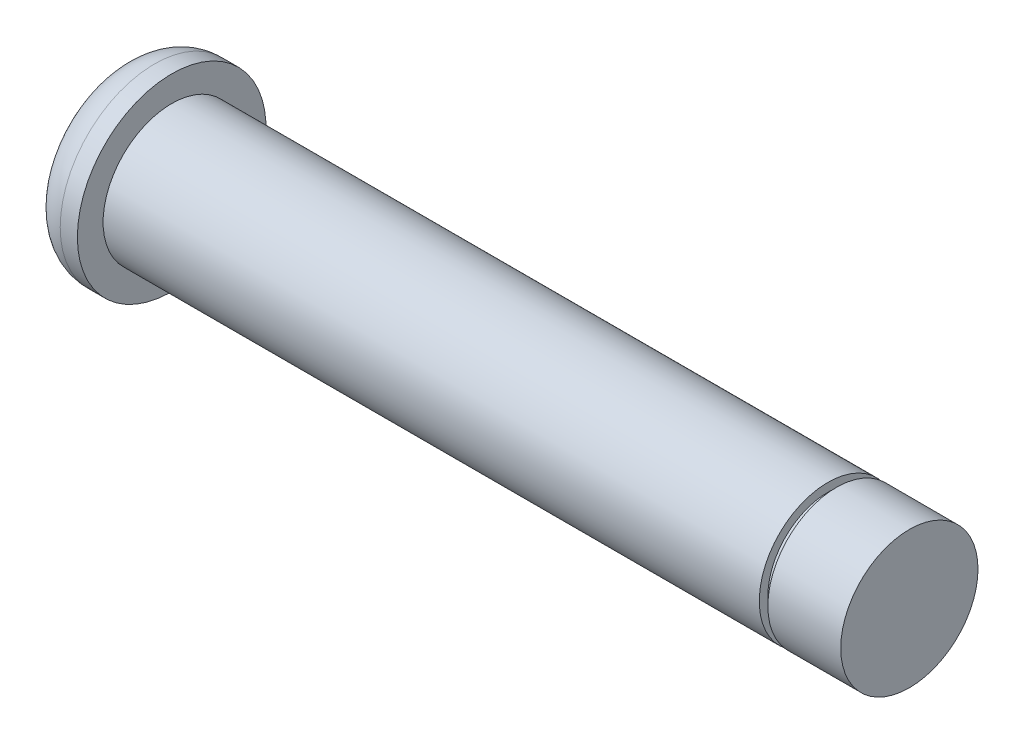
ISO-10303-21;
HEADER;
FILE_DESCRIPTION(('STEP AP214'),'2;1');
FILE_NAME('part.step','',(''),(''),'','','');
FILE_SCHEMA(('AUTOMOTIVE_DESIGN { 1 0 10303 214 1 1 1 1 }'));
ENDSEC;
DATA;
#1=APPLICATION_CONTEXT('core data for automotive mechanical design processes');
#2=APPLICATION_PROTOCOL_DEFINITION('international standard','automotive_design',2000,#1);
#3=PRODUCT_CONTEXT('',#1,'mechanical');
#4=PRODUCT('Part','Part','',(#3));
#5=PRODUCT_RELATED_PRODUCT_CATEGORY('part','',(#4));
#6=PRODUCT_DEFINITION_FORMATION('','',#4);
#7=PRODUCT_DEFINITION_CONTEXT('part definition',#1,'design');
#8=PRODUCT_DEFINITION('design','',#6,#7);
#9=PRODUCT_DEFINITION_SHAPE('','',#8);
#10=(LENGTH_UNIT() NAMED_UNIT(*) SI_UNIT(.MILLI.,.METRE.));
#11=(NAMED_UNIT(*) PLANE_ANGLE_UNIT() SI_UNIT($,.RADIAN.));
#12=(NAMED_UNIT(*) SI_UNIT($,.STERADIAN.) SOLID_ANGLE_UNIT());
#13=UNCERTAINTY_MEASURE_WITH_UNIT(LENGTH_MEASURE(1.E-05),#10,'distance_accuracy_value','');
#14=(GEOMETRIC_REPRESENTATION_CONTEXT(3) GLOBAL_UNCERTAINTY_ASSIGNED_CONTEXT((#13)) GLOBAL_UNIT_ASSIGNED_CONTEXT((#10,
#11,#12)) REPRESENTATION_CONTEXT('',''));
#15=CARTESIAN_POINT('',(0.,0.,0.));
#16=DIRECTION('',(0.,0.,1.));
#17=DIRECTION('',(1.,0.,0.));
#18=AXIS2_PLACEMENT_3D('',#15,#16,#17);
#19=CARTESIAN_POINT('',(43.,0.,0.));
#20=DIRECTION('',(-1.,0.,0.));
#21=DIRECTION('',(0.,0.,1.));
#22=AXIS2_PLACEMENT_3D('',#19,#20,#21);
#23=CYLINDRICAL_SURFACE('',#22,4.);
#24=CARTESIAN_POINT('',(0.,0.,0.));
#25=DIRECTION('',(1.,0.,0.));
#26=DIRECTION('',(0.,0.,-1.));
#27=AXIS2_PLACEMENT_3D('',#24,#25,#26);
#28=CIRCLE('',#27,4.);
#29=CARTESIAN_POINT('',(0.,0.,-4.));
#30=VERTEX_POINT('',#29);
#31=EDGE_CURVE('E77',#30,#30,#28,.T.);
#32=ORIENTED_EDGE('',*,*,#31,.T.);
#33=EDGE_LOOP('',(#32));
#34=FACE_BOUND('',#33,.T.);
#35=CARTESIAN_POINT('',(38.25,0.,0.));
#36=DIRECTION('',(1.,0.,0.));
#37=DIRECTION('',(0.,0.,-1.));
#38=AXIS2_PLACEMENT_3D('',#35,#36,#37);
#39=CIRCLE('',#38,4.);
#40=CARTESIAN_POINT('',(38.25,0.,-4.));
#41=VERTEX_POINT('',#40);
#42=EDGE_CURVE('E55',#41,#41,#39,.T.);
#43=ORIENTED_EDGE('',*,*,#42,.F.);
#44=EDGE_LOOP('',(#43));
#45=FACE_BOUND('',#44,.T.);
#46=ADVANCED_FACE('F37',(#34,#45),#23,.T.);
#47=CARTESIAN_POINT('',(-3.,0.,0.));
#48=DIRECTION('',(1.,0.,0.));
#49=DIRECTION('',(0.,0.,-1.));
#50=AXIS2_PLACEMENT_3D('',#47,#48,#49);
#51=CYLINDRICAL_SURFACE('',#50,5.5);
#52=CARTESIAN_POINT('',(-1.,0.,0.));
#53=DIRECTION('',(-1.,0.,0.));
#54=DIRECTION('',(0.,0.,1.));
#55=AXIS2_PLACEMENT_3D('',#52,#53,#54);
#56=CIRCLE('',#55,5.5);
#57=CARTESIAN_POINT('',(-1.,0.,5.5));
#58=VERTEX_POINT('',#57);
#59=EDGE_CURVE('E10',#58,#58,#56,.F.);
#60=ORIENTED_EDGE('',*,*,#59,.T.);
#61=EDGE_LOOP('',(#60));
#62=FACE_BOUND('',#61,.T.);
#63=CARTESIAN_POINT('',(0.,0.,0.));
#64=DIRECTION('',(-1.,0.,0.));
#65=DIRECTION('',(0.,0.,1.));
#66=AXIS2_PLACEMENT_3D('',#63,#64,#65);
#67=CIRCLE('',#66,5.5);
#68=CARTESIAN_POINT('',(0.,0.,5.5));
#69=VERTEX_POINT('',#68);
#70=EDGE_CURVE('E64',#69,#69,#67,.T.);
#71=ORIENTED_EDGE('',*,*,#70,.T.);
#72=EDGE_LOOP('',(#71));
#73=FACE_BOUND('',#72,.T.);
#74=ADVANCED_FACE('F93',(#62,#73),#51,.T.);
#75=CARTESIAN_POINT('',(-3.,0.,0.));
#76=DIRECTION('',(-1.,0.,0.));
#77=DIRECTION('',(0.,0.,1.));
#78=AXIS2_PLACEMENT_3D('',#75,#76,#77);
#79=PLANE('',#78);
#80=CARTESIAN_POINT('',(-3.,0.,0.));
#81=DIRECTION('',(-1.,0.,0.));
#82=DIRECTION('',(0.,0.,1.));
#83=AXIS2_PLACEMENT_3D('',#80,#81,#82);
#84=CIRCLE('',#83,3.5);
#85=CARTESIAN_POINT('',(-3.,0.,3.5));
#86=VERTEX_POINT('',#85);
#87=EDGE_CURVE('E46',#86,#86,#84,.T.);
#88=ORIENTED_EDGE('',*,*,#87,.T.);
#89=EDGE_LOOP('',(#88));
#90=FACE_BOUND('',#89,.T.);
#91=ADVANCED_FACE('F89',(#90),#79,.T.);
#92=CARTESIAN_POINT('',(0.,0.,0.));
#93=DIRECTION('',(-1.,0.,0.));
#94=DIRECTION('',(0.,0.,1.));
#95=AXIS2_PLACEMENT_3D('',#92,#93,#94);
#96=PLANE('',#95);
#97=ORIENTED_EDGE('',*,*,#31,.F.);
#98=EDGE_LOOP('',(#97));
#99=FACE_BOUND('',#98,.T.);
#100=ORIENTED_EDGE('',*,*,#70,.F.);
#101=EDGE_LOOP('',(#100));
#102=FACE_BOUND('',#101,.T.);
#103=ADVANCED_FACE('F86',(#99,#102),#96,.F.);
#104=CARTESIAN_POINT('',(-1.,0.,0.));
#105=DIRECTION('',(-1.,0.,0.));
#106=DIRECTION('',(0.,0.,1.));
#107=AXIS2_PLACEMENT_3D('',#104,#105,#106);
#108=TOROIDAL_SURFACE('',#107,3.5,2.);
#109=ORIENTED_EDGE('',*,*,#59,.F.);
#110=EDGE_LOOP('',(#109));
#111=FACE_BOUND('',#110,.T.);
#112=ORIENTED_EDGE('',*,*,#87,.F.);
#113=EDGE_LOOP('',(#112));
#114=FACE_BOUND('',#113,.T.);
#115=ADVANCED_FACE('F39',(#111,#114),#108,.T.);
#116=CARTESIAN_POINT('',(38.75,4.5,0.));
#117=DIRECTION('',(-1.,0.,0.));
#118=DIRECTION('',(0.,0.,1.));
#119=AXIS2_PLACEMENT_3D('',#116,#117,#118);
#120=PLANE('',#119);
#121=CARTESIAN_POINT('',(38.75,0.,0.));
#122=DIRECTION('',(-1.,0.,0.));
#123=DIRECTION('',(0.,0.,1.));
#124=AXIS2_PLACEMENT_3D('',#121,#122,#123);
#125=CIRCLE('',#124,3.5);
#126=CARTESIAN_POINT('',(38.75,0.,3.5));
#127=VERTEX_POINT('',#126);
#128=EDGE_CURVE('E66',#127,#127,#125,.T.);
#129=ORIENTED_EDGE('',*,*,#128,.F.);
#130=EDGE_LOOP('',(#129));
#131=FACE_BOUND('',#130,.T.);
#132=CARTESIAN_POINT('',(38.75,0.,0.));
#133=DIRECTION('',(-1.,0.,0.));
#134=DIRECTION('',(0.,0.,1.));
#135=AXIS2_PLACEMENT_3D('',#132,#133,#134);
#136=CIRCLE('',#135,4.);
#137=CARTESIAN_POINT('',(38.75,0.,4.));
#138=VERTEX_POINT('',#137);
#139=EDGE_CURVE('E41',#138,#138,#136,.T.);
#140=ORIENTED_EDGE('',*,*,#139,.T.);
#141=EDGE_LOOP('',(#140));
#142=FACE_BOUND('',#141,.T.);
#143=ADVANCED_FACE('F117',(#131,#142),#120,.T.);
#144=CARTESIAN_POINT('',(38.25,4.5,0.));
#145=DIRECTION('',(1.,0.,0.));
#146=DIRECTION('',(0.,0.,-1.));
#147=AXIS2_PLACEMENT_3D('',#144,#145,#146);
#148=PLANE('',#147);
#149=CARTESIAN_POINT('',(38.25,0.,0.));
#150=DIRECTION('',(-1.,0.,0.));
#151=DIRECTION('',(0.,0.,1.));
#152=AXIS2_PLACEMENT_3D('',#149,#150,#151);
#153=CIRCLE('',#152,3.5);
#154=CARTESIAN_POINT('',(38.25,0.,3.5));
#155=VERTEX_POINT('',#154);
#156=EDGE_CURVE('E58',#155,#155,#153,.T.);
#157=ORIENTED_EDGE('',*,*,#156,.T.);
#158=EDGE_LOOP('',(#157));
#159=FACE_BOUND('',#158,.T.);
#160=ORIENTED_EDGE('',*,*,#42,.T.);
#161=EDGE_LOOP('',(#160));
#162=FACE_BOUND('',#161,.T.);
#163=ADVANCED_FACE('F119',(#159,#162),#148,.T.);
#164=CARTESIAN_POINT('',(0.,0.,0.));
#165=DIRECTION('',(-1.,0.,0.));
#166=DIRECTION('',(0.,0.,1.));
#167=AXIS2_PLACEMENT_3D('',#164,#165,#166);
#168=CYLINDRICAL_SURFACE('',#167,3.5);
#169=ORIENTED_EDGE('',*,*,#128,.T.);
#170=EDGE_LOOP('',(#169));
#171=FACE_BOUND('',#170,.T.);
#172=ORIENTED_EDGE('',*,*,#156,.F.);
#173=EDGE_LOOP('',(#172));
#174=FACE_BOUND('',#173,.T.);
#175=ADVANCED_FACE('F106',(#171,#174),#168,.T.);
#176=CARTESIAN_POINT('',(43.,0.,0.));
#177=DIRECTION('',(1.,0.,0.));
#178=DIRECTION('',(0.,0.,-1.));
#179=AXIS2_PLACEMENT_3D('',#176,#177,#178);
#180=PLANE('',#179);
#181=CARTESIAN_POINT('',(43.,0.,0.));
#182=DIRECTION('',(1.,0.,0.));
#183=DIRECTION('',(0.,0.,-1.));
#184=AXIS2_PLACEMENT_3D('',#181,#182,#183);
#185=CIRCLE('',#184,4.);
#186=CARTESIAN_POINT('',(43.,0.,-4.));
#187=VERTEX_POINT('',#186);
#188=EDGE_CURVE('E52',#187,#187,#185,.T.);
#189=ORIENTED_EDGE('',*,*,#188,.T.);
#190=EDGE_LOOP('',(#189));
#191=FACE_BOUND('',#190,.T.);
#192=ADVANCED_FACE('F105',(#191),#180,.T.);
#193=ORIENTED_EDGE('',*,*,#188,.F.);
#194=EDGE_LOOP('',(#193));
#195=FACE_BOUND('',#194,.T.);
#196=ORIENTED_EDGE('',*,*,#139,.F.);
#197=EDGE_LOOP('',(#196));
#198=FACE_BOUND('',#197,.T.);
#199=ADVANCED_FACE('F103',(#195,#198),#23,.T.);
#200=CLOSED_SHELL('',(#46,#74,#91,#103,#115,#143,#163,#175,#192,#199));
#201=MANIFOLD_SOLID_BREP('B2',#200);
#202=ADVANCED_BREP_SHAPE_REPRESENTATION('',(#18,#201),#14);
#203=SHAPE_DEFINITION_REPRESENTATION(#9,#202);
ENDSEC;
END-ISO-10303-21;
